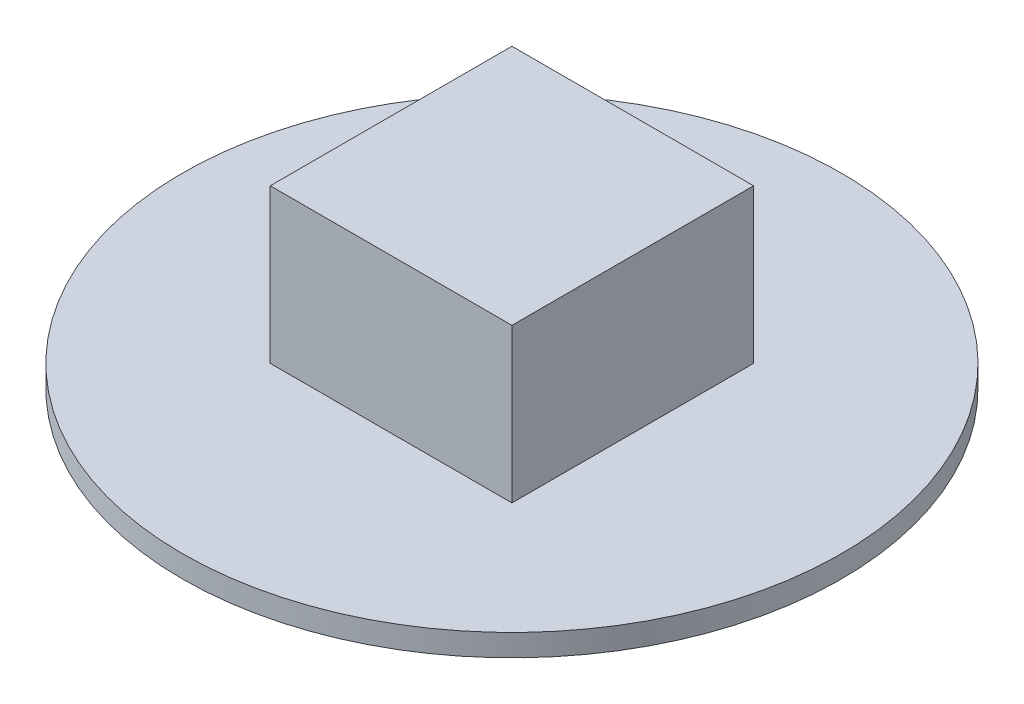
ISO-10303-21;
HEADER;
FILE_DESCRIPTION(('STEP AP214'),'2;1');
FILE_NAME('part.step','',(''),(''),'','','');
FILE_SCHEMA(('AUTOMOTIVE_DESIGN { 1 0 10303 214 1 1 1 1 }'));
ENDSEC;
DATA;
#1=APPLICATION_CONTEXT('core data for automotive mechanical design processes');
#2=APPLICATION_PROTOCOL_DEFINITION('international standard','automotive_design',2000,#1);
#3=PRODUCT_CONTEXT('',#1,'mechanical');
#4=PRODUCT('Part','Part','',(#3));
#5=PRODUCT_RELATED_PRODUCT_CATEGORY('part','',(#4));
#6=PRODUCT_DEFINITION_FORMATION('','',#4);
#7=PRODUCT_DEFINITION_CONTEXT('part definition',#1,'design');
#8=PRODUCT_DEFINITION('design','',#6,#7);
#9=PRODUCT_DEFINITION_SHAPE('','',#8);
#10=(LENGTH_UNIT() NAMED_UNIT(*) SI_UNIT(.MILLI.,.METRE.));
#11=(NAMED_UNIT(*) PLANE_ANGLE_UNIT() SI_UNIT($,.RADIAN.));
#12=(NAMED_UNIT(*) SI_UNIT($,.STERADIAN.) SOLID_ANGLE_UNIT());
#13=UNCERTAINTY_MEASURE_WITH_UNIT(LENGTH_MEASURE(1.E-05),#10,'distance_accuracy_value','');
#14=(GEOMETRIC_REPRESENTATION_CONTEXT(3) GLOBAL_UNCERTAINTY_ASSIGNED_CONTEXT((#13)) GLOBAL_UNIT_ASSIGNED_CONTEXT((#10,
#11,#12)) REPRESENTATION_CONTEXT('',''));
#15=CARTESIAN_POINT('',(0.,0.,0.));
#16=DIRECTION('',(0.,0.,1.));
#17=DIRECTION('',(1.,0.,0.));
#18=AXIS2_PLACEMENT_3D('',#15,#16,#17);
#19=CARTESIAN_POINT('',(0.,10.,0.));
#20=DIRECTION('',(0.,-1.,0.));
#21=DIRECTION('',(0.,0.,-1.));
#22=AXIS2_PLACEMENT_3D('',#19,#20,#21);
#23=CYLINDRICAL_SURFACE('',#22,150.);
#24=CARTESIAN_POINT('',(0.,10.,0.));
#25=DIRECTION('',(0.,1.,0.));
#26=DIRECTION('',(0.,0.,1.));
#27=AXIS2_PLACEMENT_3D('',#24,#25,#26);
#28=CIRCLE('',#27,150.);
#29=CARTESIAN_POINT('',(0.,10.,150.));
#30=VERTEX_POINT('',#29);
#31=EDGE_CURVE('E11',#30,#30,#28,.T.);
#32=ORIENTED_EDGE('',*,*,#31,.F.);
#33=EDGE_LOOP('',(#32));
#34=FACE_BOUND('',#33,.T.);
#35=CARTESIAN_POINT('',(0.,0.,0.));
#36=DIRECTION('',(0.,1.,0.));
#37=DIRECTION('',(0.,0.,1.));
#38=AXIS2_PLACEMENT_3D('',#35,#36,#37);
#39=CIRCLE('',#38,150.);
#40=CARTESIAN_POINT('',(0.,0.,150.));
#41=VERTEX_POINT('',#40);
#42=EDGE_CURVE('E43',#41,#41,#39,.T.);
#43=ORIENTED_EDGE('',*,*,#42,.T.);
#44=EDGE_LOOP('',(#43));
#45=FACE_BOUND('',#44,.T.);
#46=ADVANCED_FACE('F40',(#34,#45),#23,.T.);
#47=CARTESIAN_POINT('',(0.,10.,0.));
#48=DIRECTION('',(0.,1.,0.));
#49=DIRECTION('',(0.,0.,1.));
#50=AXIS2_PLACEMENT_3D('',#47,#48,#49);
#51=PLANE('',#50);
#52=DIRECTION('',(0.,0.,-1.));
#53=VECTOR('',#52,1.);
#54=CARTESIAN_POINT('',(55.,10.,-55.));
#55=LINE('',#54,#53);
#56=CARTESIAN_POINT('',(55.,10.,55.));
#57=VERTEX_POINT('',#56);
#58=CARTESIAN_POINT('',(55.,10.,-55.));
#59=VERTEX_POINT('',#58);
#60=EDGE_CURVE('E54',#57,#59,#55,.T.);
#61=ORIENTED_EDGE('',*,*,#60,.F.);
#62=DIRECTION('',(1.,0.,0.));
#63=VECTOR('',#62,1.);
#64=CARTESIAN_POINT('',(-55.,10.,55.));
#65=LINE('',#64,#63);
#66=CARTESIAN_POINT('',(-55.,10.,55.));
#67=VERTEX_POINT('',#66);
#68=EDGE_CURVE('E58',#67,#57,#65,.T.);
#69=ORIENTED_EDGE('',*,*,#68,.F.);
#70=DIRECTION('',(0.,0.,1.));
#71=VECTOR('',#70,1.);
#72=CARTESIAN_POINT('',(-55.,10.,-55.));
#73=LINE('',#72,#71);
#74=CARTESIAN_POINT('',(-55.,10.,-55.));
#75=VERTEX_POINT('',#74);
#76=EDGE_CURVE('E110',#75,#67,#73,.T.);
#77=ORIENTED_EDGE('',*,*,#76,.F.);
#78=DIRECTION('',(-1.,0.,0.));
#79=VECTOR('',#78,1.);
#80=CARTESIAN_POINT('',(-55.,10.,-55.));
#81=LINE('',#80,#79);
#82=EDGE_CURVE('E112',#59,#75,#81,.T.);
#83=ORIENTED_EDGE('',*,*,#82,.F.);
#84=EDGE_LOOP('',(#61,#69,#77,#83));
#85=FACE_BOUND('',#84,.T.);
#86=ORIENTED_EDGE('',*,*,#31,.T.);
#87=EDGE_LOOP('',(#86));
#88=FACE_BOUND('',#87,.T.);
#89=ADVANCED_FACE('F130',(#85,#88),#51,.T.);
#90=CARTESIAN_POINT('',(0.,0.,0.));
#91=DIRECTION('',(0.,1.,0.));
#92=DIRECTION('',(0.,0.,1.));
#93=AXIS2_PLACEMENT_3D('',#90,#91,#92);
#94=PLANE('',#93);
#95=ORIENTED_EDGE('',*,*,#42,.F.);
#96=EDGE_LOOP('',(#95));
#97=FACE_BOUND('',#96,.T.);
#98=ADVANCED_FACE('F135',(#97),#94,.F.);
#99=CARTESIAN_POINT('',(55.,80.,-55.));
#100=DIRECTION('',(-1.,0.,0.));
#101=DIRECTION('',(0.,0.,1.));
#102=AXIS2_PLACEMENT_3D('',#99,#100,#101);
#103=PLANE('',#102);
#104=ORIENTED_EDGE('',*,*,#60,.T.);
#105=DIRECTION('',(0.,-1.,0.));
#106=VECTOR('',#105,1.);
#107=CARTESIAN_POINT('',(55.,80.,-55.));
#108=LINE('',#107,#106);
#109=CARTESIAN_POINT('',(55.,80.,-55.));
#110=VERTEX_POINT('',#109);
#111=EDGE_CURVE('E83',#110,#59,#108,.T.);
#112=ORIENTED_EDGE('',*,*,#111,.F.);
#113=DIRECTION('',(0.,0.,-1.));
#114=VECTOR('',#113,1.);
#115=CARTESIAN_POINT('',(55.,80.,-55.));
#116=LINE('',#115,#114);
#117=CARTESIAN_POINT('',(55.,80.,55.));
#118=VERTEX_POINT('',#117);
#119=EDGE_CURVE('E89',#118,#110,#116,.T.);
#120=ORIENTED_EDGE('',*,*,#119,.F.);
#121=DIRECTION('',(0.,-1.,0.));
#122=VECTOR('',#121,1.);
#123=CARTESIAN_POINT('',(55.,80.,55.));
#124=LINE('',#123,#122);
#125=EDGE_CURVE('E107',#118,#57,#124,.T.);
#126=ORIENTED_EDGE('',*,*,#125,.T.);
#127=EDGE_LOOP('',(#104,#112,#120,#126));
#128=FACE_BOUND('',#127,.T.);
#129=ADVANCED_FACE('F99',(#128),#103,.F.);
#130=CARTESIAN_POINT('',(-55.,80.,-55.));
#131=DIRECTION('',(0.,0.,1.));
#132=DIRECTION('',(1.,0.,0.));
#133=AXIS2_PLACEMENT_3D('',#130,#131,#132);
#134=PLANE('',#133);
#135=ORIENTED_EDGE('',*,*,#82,.T.);
#136=DIRECTION('',(0.,-1.,0.));
#137=VECTOR('',#136,1.);
#138=CARTESIAN_POINT('',(-55.,80.,-55.));
#139=LINE('',#138,#137);
#140=CARTESIAN_POINT('',(-55.,80.,-55.));
#141=VERTEX_POINT('',#140);
#142=EDGE_CURVE('E85',#141,#75,#139,.T.);
#143=ORIENTED_EDGE('',*,*,#142,.F.);
#144=DIRECTION('',(-1.,0.,0.));
#145=VECTOR('',#144,1.);
#146=CARTESIAN_POINT('',(-55.,80.,-55.));
#147=LINE('',#146,#145);
#148=EDGE_CURVE('E78',#110,#141,#147,.T.);
#149=ORIENTED_EDGE('',*,*,#148,.F.);
#150=ORIENTED_EDGE('',*,*,#111,.T.);
#151=EDGE_LOOP('',(#135,#143,#149,#150));
#152=FACE_BOUND('',#151,.T.);
#153=ADVANCED_FACE('F81',(#152),#134,.F.);
#154=CARTESIAN_POINT('',(-55.,80.,-55.));
#155=DIRECTION('',(1.,0.,0.));
#156=DIRECTION('',(0.,0.,-1.));
#157=AXIS2_PLACEMENT_3D('',#154,#155,#156);
#158=PLANE('',#157);
#159=ORIENTED_EDGE('',*,*,#76,.T.);
#160=DIRECTION('',(0.,-1.,0.));
#161=VECTOR('',#160,1.);
#162=CARTESIAN_POINT('',(-55.,80.,55.));
#163=LINE('',#162,#161);
#164=CARTESIAN_POINT('',(-55.,80.,55.));
#165=VERTEX_POINT('',#164);
#166=EDGE_CURVE('E102',#165,#67,#163,.T.);
#167=ORIENTED_EDGE('',*,*,#166,.F.);
#168=DIRECTION('',(0.,0.,1.));
#169=VECTOR('',#168,1.);
#170=CARTESIAN_POINT('',(-55.,80.,-55.));
#171=LINE('',#170,#169);
#172=EDGE_CURVE('E88',#141,#165,#171,.T.);
#173=ORIENTED_EDGE('',*,*,#172,.F.);
#174=ORIENTED_EDGE('',*,*,#142,.T.);
#175=EDGE_LOOP('',(#159,#167,#173,#174));
#176=FACE_BOUND('',#175,.T.);
#177=ADVANCED_FACE('F118',(#176),#158,.F.);
#178=CARTESIAN_POINT('',(-55.,80.,55.));
#179=DIRECTION('',(0.,0.,-1.));
#180=DIRECTION('',(-1.,0.,0.));
#181=AXIS2_PLACEMENT_3D('',#178,#179,#180);
#182=PLANE('',#181);
#183=ORIENTED_EDGE('',*,*,#68,.T.);
#184=ORIENTED_EDGE('',*,*,#125,.F.);
#185=DIRECTION('',(1.,0.,0.));
#186=VECTOR('',#185,1.);
#187=CARTESIAN_POINT('',(-55.,80.,55.));
#188=LINE('',#187,#186);
#189=EDGE_CURVE('E94',#165,#118,#188,.T.);
#190=ORIENTED_EDGE('',*,*,#189,.F.);
#191=ORIENTED_EDGE('',*,*,#166,.T.);
#192=EDGE_LOOP('',(#183,#184,#190,#191));
#193=FACE_BOUND('',#192,.T.);
#194=ADVANCED_FACE('F120',(#193),#182,.F.);
#195=CARTESIAN_POINT('',(0.,80.,0.));
#196=DIRECTION('',(0.,1.,0.));
#197=DIRECTION('',(0.,0.,1.));
#198=AXIS2_PLACEMENT_3D('',#195,#196,#197);
#199=PLANE('',#198);
#200=ORIENTED_EDGE('',*,*,#119,.T.);
#201=ORIENTED_EDGE('',*,*,#148,.T.);
#202=ORIENTED_EDGE('',*,*,#172,.T.);
#203=ORIENTED_EDGE('',*,*,#189,.T.);
#204=EDGE_LOOP('',(#200,#201,#202,#203));
#205=FACE_BOUND('',#204,.T.);
#206=ADVANCED_FACE('F92',(#205),#199,.T.);
#207=CLOSED_SHELL('',(#46,#89,#98,#129,#153,#177,#194,#206));
#208=MANIFOLD_SOLID_BREP('B2',#207);
#209=ADVANCED_BREP_SHAPE_REPRESENTATION('',(#18,#208),#14);
#210=SHAPE_DEFINITION_REPRESENTATION(#9,#209);
ENDSEC;
END-ISO-10303-21;
